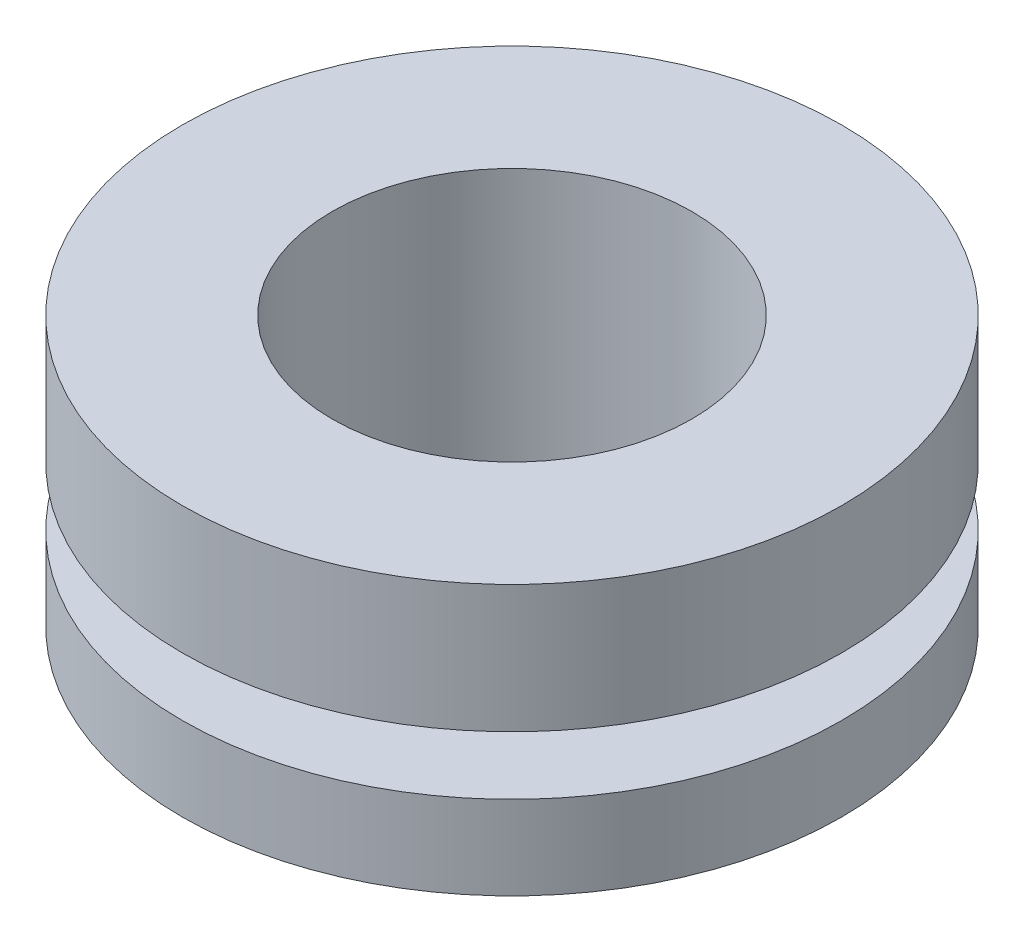
ISO-10303-21;
HEADER;
FILE_DESCRIPTION(('STEP AP214'),'2;1');
FILE_NAME('part.step','',(''),(''),'','','');
FILE_SCHEMA(('AUTOMOTIVE_DESIGN { 1 0 10303 214 1 1 1 1 }'));
ENDSEC;
DATA;
#1=APPLICATION_CONTEXT('core data for automotive mechanical design processes');
#2=APPLICATION_PROTOCOL_DEFINITION('international standard','automotive_design',2000,#1);
#3=PRODUCT_CONTEXT('',#1,'mechanical');
#4=PRODUCT('Part','Part','',(#3));
#5=PRODUCT_RELATED_PRODUCT_CATEGORY('part','',(#4));
#6=PRODUCT_DEFINITION_FORMATION('','',#4);
#7=PRODUCT_DEFINITION_CONTEXT('part definition',#1,'design');
#8=PRODUCT_DEFINITION('design','',#6,#7);
#9=PRODUCT_DEFINITION_SHAPE('','',#8);
#10=(LENGTH_UNIT() NAMED_UNIT(*) SI_UNIT(.MILLI.,.METRE.));
#11=(NAMED_UNIT(*) PLANE_ANGLE_UNIT() SI_UNIT($,.RADIAN.));
#12=(NAMED_UNIT(*) SI_UNIT($,.STERADIAN.) SOLID_ANGLE_UNIT());
#13=UNCERTAINTY_MEASURE_WITH_UNIT(LENGTH_MEASURE(1.E-05),#10,'distance_accuracy_value','');
#14=(GEOMETRIC_REPRESENTATION_CONTEXT(3) GLOBAL_UNCERTAINTY_ASSIGNED_CONTEXT((#13)) GLOBAL_UNIT_ASSIGNED_CONTEXT((#10,
#11,#12)) REPRESENTATION_CONTEXT('',''));
#15=CARTESIAN_POINT('',(0.,0.,0.));
#16=DIRECTION('',(0.,0.,1.));
#17=DIRECTION('',(1.,0.,0.));
#18=AXIS2_PLACEMENT_3D('',#15,#16,#17);
#19=CARTESIAN_POINT('',(0.,4.5,0.));
#20=DIRECTION('',(0.,-1.,0.));
#21=DIRECTION('',(0.,0.,-1.));
#22=AXIS2_PLACEMENT_3D('',#19,#20,#21);
#23=CYLINDRICAL_SURFACE('',#22,5.5);
#24=CARTESIAN_POINT('',(0.,2.37132795063131,0.));
#25=DIRECTION('',(0.,1.,0.));
#26=DIRECTION('',(0.,0.,1.));
#27=AXIS2_PLACEMENT_3D('',#24,#25,#26);
#28=CIRCLE('',#27,5.5);
#29=CARTESIAN_POINT('',(0.,2.37132795063131,5.5));
#30=VERTEX_POINT('',#29);
#31=EDGE_CURVE('E49',#30,#30,#28,.T.);
#32=ORIENTED_EDGE('',*,*,#31,.T.);
#33=EDGE_LOOP('',(#32));
#34=FACE_BOUND('',#33,.T.);
#35=CARTESIAN_POINT('',(0.,4.5,0.));
#36=DIRECTION('',(0.,1.,0.));
#37=DIRECTION('',(0.,0.,1.));
#38=AXIS2_PLACEMENT_3D('',#35,#36,#37);
#39=CIRCLE('',#38,5.5);
#40=CARTESIAN_POINT('',(0.,4.5,5.5));
#41=VERTEX_POINT('',#40);
#42=EDGE_CURVE('E10',#41,#41,#39,.T.);
#43=ORIENTED_EDGE('',*,*,#42,.F.);
#44=EDGE_LOOP('',(#43));
#45=FACE_BOUND('',#44,.T.);
#46=ADVANCED_FACE('F33',(#34,#45),#23,.T.);
#47=CARTESIAN_POINT('',(0.,4.5,0.));
#48=DIRECTION('',(0.,1.,0.));
#49=DIRECTION('',(0.,0.,1.));
#50=AXIS2_PLACEMENT_3D('',#47,#48,#49);
#51=PLANE('',#50);
#52=ORIENTED_EDGE('',*,*,#42,.T.);
#53=EDGE_LOOP('',(#52));
#54=FACE_BOUND('',#53,.T.);
#55=CARTESIAN_POINT('',(0.,4.5,0.));
#56=DIRECTION('',(0.,1.,0.));
#57=DIRECTION('',(0.,0.,1.));
#58=AXIS2_PLACEMENT_3D('',#55,#56,#57);
#59=CIRCLE('',#58,3.);
#60=CARTESIAN_POINT('',(0.,4.5,3.));
#61=VERTEX_POINT('',#60);
#62=EDGE_CURVE('E44',#61,#61,#59,.T.);
#63=ORIENTED_EDGE('',*,*,#62,.F.);
#64=EDGE_LOOP('',(#63));
#65=FACE_BOUND('',#64,.T.);
#66=ADVANCED_FACE('F74',(#54,#65),#51,.T.);
#67=CARTESIAN_POINT('',(0.,0.,0.));
#68=DIRECTION('',(0.,1.,0.));
#69=DIRECTION('',(0.,0.,1.));
#70=AXIS2_PLACEMENT_3D('',#67,#68,#69);
#71=PLANE('',#70);
#72=CARTESIAN_POINT('',(0.,0.,0.));
#73=DIRECTION('',(0.,1.,0.));
#74=DIRECTION('',(0.,0.,1.));
#75=AXIS2_PLACEMENT_3D('',#72,#73,#74);
#76=CIRCLE('',#75,5.5);
#77=CARTESIAN_POINT('',(0.,0.,5.5));
#78=VERTEX_POINT('',#77);
#79=EDGE_CURVE('E37',#78,#78,#76,.T.);
#80=ORIENTED_EDGE('',*,*,#79,.F.);
#81=EDGE_LOOP('',(#80));
#82=FACE_BOUND('',#81,.T.);
#83=CARTESIAN_POINT('',(0.,0.,0.));
#84=DIRECTION('',(0.,1.,0.));
#85=DIRECTION('',(0.,0.,1.));
#86=AXIS2_PLACEMENT_3D('',#83,#84,#85);
#87=CIRCLE('',#86,3.);
#88=CARTESIAN_POINT('',(0.,0.,3.));
#89=VERTEX_POINT('',#88);
#90=EDGE_CURVE('E46',#89,#89,#87,.T.);
#91=ORIENTED_EDGE('',*,*,#90,.T.);
#92=EDGE_LOOP('',(#91));
#93=FACE_BOUND('',#92,.T.);
#94=ADVANCED_FACE('F69',(#82,#93),#71,.F.);
#95=CARTESIAN_POINT('',(0.,1.39538843793237,0.));
#96=DIRECTION('',(0.,1.,0.));
#97=DIRECTION('',(0.,0.,1.));
#98=AXIS2_PLACEMENT_3D('',#95,#96,#97);
#99=CIRCLE('',#98,5.5);
#100=CARTESIAN_POINT('',(0.,1.39538843793237,5.5));
#101=VERTEX_POINT('',#100);
#102=EDGE_CURVE('E60',#101,#101,#99,.T.);
#103=ORIENTED_EDGE('',*,*,#102,.F.);
#104=EDGE_LOOP('',(#103));
#105=FACE_BOUND('',#104,.T.);
#106=ORIENTED_EDGE('',*,*,#79,.T.);
#107=EDGE_LOOP('',(#106));
#108=FACE_BOUND('',#107,.T.);
#109=ADVANCED_FACE('F35',(#105,#108),#23,.T.);
#110=CARTESIAN_POINT('',(0.,4.5,0.));
#111=DIRECTION('',(0.,-1.,0.));
#112=DIRECTION('',(0.,0.,-1.));
#113=AXIS2_PLACEMENT_3D('',#110,#111,#112);
#114=CYLINDRICAL_SURFACE('',#113,3.);
#115=ORIENTED_EDGE('',*,*,#62,.T.);
#116=EDGE_LOOP('',(#115));
#117=FACE_BOUND('',#116,.T.);
#118=ORIENTED_EDGE('',*,*,#90,.F.);
#119=EDGE_LOOP('',(#118));
#120=FACE_BOUND('',#119,.T.);
#121=ADVANCED_FACE('F68',(#117,#120),#114,.F.);
#122=CARTESIAN_POINT('',(-5.5,2.37132795063131,0.));
#123=DIRECTION('',(0.,1.,0.));
#124=DIRECTION('',(0.,0.,1.));
#125=AXIS2_PLACEMENT_3D('',#122,#123,#124);
#126=PLANE('',#125);
#127=ORIENTED_EDGE('',*,*,#31,.F.);
#128=EDGE_LOOP('',(#127));
#129=FACE_BOUND('',#128,.T.);
#130=CARTESIAN_POINT('',(0.,2.37132795063131,0.));
#131=DIRECTION('',(0.,1.,0.));
#132=DIRECTION('',(0.,0.,1.));
#133=AXIS2_PLACEMENT_3D('',#130,#131,#132);
#134=CIRCLE('',#133,3.80677027313625);
#135=CARTESIAN_POINT('',(0.,2.37132795063131,3.80677027313625));
#136=VERTEX_POINT('',#135);
#137=EDGE_CURVE('E54',#136,#136,#134,.T.);
#138=ORIENTED_EDGE('',*,*,#137,.T.);
#139=EDGE_LOOP('',(#138));
#140=FACE_BOUND('',#139,.T.);
#141=ADVANCED_FACE('F78',(#129,#140),#126,.F.);
#142=CARTESIAN_POINT('',(0.,4.5,0.));
#143=DIRECTION('',(0.,1.,0.));
#144=DIRECTION('',(0.,0.,1.));
#145=AXIS2_PLACEMENT_3D('',#142,#143,#144);
#146=CYLINDRICAL_SURFACE('',#145,3.80677027313625);
#147=ORIENTED_EDGE('',*,*,#137,.F.);
#148=EDGE_LOOP('',(#147));
#149=FACE_BOUND('',#148,.T.);
#150=CARTESIAN_POINT('',(0.,1.39538843793237,0.));
#151=DIRECTION('',(0.,1.,0.));
#152=DIRECTION('',(0.,0.,1.));
#153=AXIS2_PLACEMENT_3D('',#150,#151,#152);
#154=CIRCLE('',#153,3.80677027313625);
#155=CARTESIAN_POINT('',(0.,1.39538843793237,3.80677027313625));
#156=VERTEX_POINT('',#155);
#157=EDGE_CURVE('E57',#156,#156,#154,.T.);
#158=ORIENTED_EDGE('',*,*,#157,.T.);
#159=EDGE_LOOP('',(#158));
#160=FACE_BOUND('',#159,.T.);
#161=ADVANCED_FACE('F84',(#149,#160),#146,.T.);
#162=CARTESIAN_POINT('',(-3.80677027313625,1.39538843793237,0.));
#163=DIRECTION('',(0.,-1.,0.));
#164=DIRECTION('',(0.,0.,-1.));
#165=AXIS2_PLACEMENT_3D('',#162,#163,#164);
#166=PLANE('',#165);
#167=ORIENTED_EDGE('',*,*,#157,.F.);
#168=EDGE_LOOP('',(#167));
#169=FACE_BOUND('',#168,.T.);
#170=ORIENTED_EDGE('',*,*,#102,.T.);
#171=EDGE_LOOP('',(#170));
#172=FACE_BOUND('',#171,.T.);
#173=ADVANCED_FACE('F64',(#169,#172),#166,.F.);
#174=CLOSED_SHELL('',(#46,#66,#94,#109,#121,#141,#161,#173));
#175=MANIFOLD_SOLID_BREP('B2',#174);
#176=ADVANCED_BREP_SHAPE_REPRESENTATION('',(#18,#175),#14);
#177=SHAPE_DEFINITION_REPRESENTATION(#9,#176);
ENDSEC;
END-ISO-10303-21;
